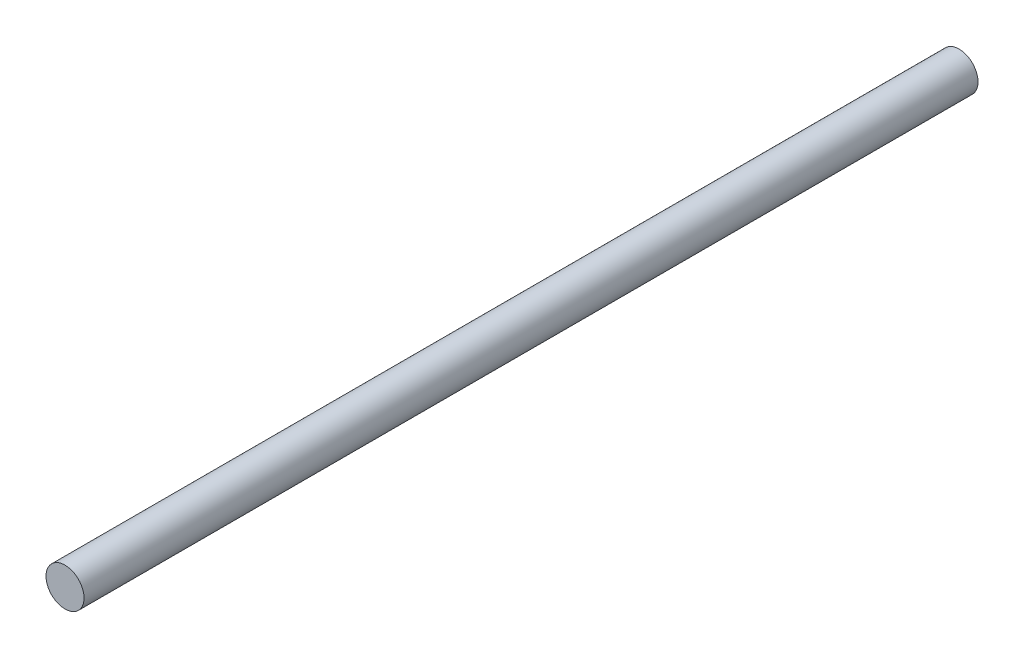
ISO-10303-21;
HEADER;
FILE_DESCRIPTION(('STEP AP214'),'2;1');
FILE_NAME('part.step','',(''),(''),'','','');
FILE_SCHEMA(('AUTOMOTIVE_DESIGN { 1 0 10303 214 1 1 1 1 }'));
ENDSEC;
DATA;
#1=APPLICATION_CONTEXT('core data for automotive mechanical design processes');
#2=APPLICATION_PROTOCOL_DEFINITION('international standard','automotive_design',2000,#1);
#3=PRODUCT_CONTEXT('',#1,'mechanical');
#4=PRODUCT('Part','Part','',(#3));
#5=PRODUCT_RELATED_PRODUCT_CATEGORY('part','',(#4));
#6=PRODUCT_DEFINITION_FORMATION('','',#4);
#7=PRODUCT_DEFINITION_CONTEXT('part definition',#1,'design');
#8=PRODUCT_DEFINITION('design','',#6,#7);
#9=PRODUCT_DEFINITION_SHAPE('','',#8);
#10=(LENGTH_UNIT() NAMED_UNIT(*) SI_UNIT(.MILLI.,.METRE.));
#11=(NAMED_UNIT(*) PLANE_ANGLE_UNIT() SI_UNIT($,.RADIAN.));
#12=(NAMED_UNIT(*) SI_UNIT($,.STERADIAN.) SOLID_ANGLE_UNIT());
#13=UNCERTAINTY_MEASURE_WITH_UNIT(LENGTH_MEASURE(1.E-05),#10,'distance_accuracy_value','');
#14=(GEOMETRIC_REPRESENTATION_CONTEXT(3) GLOBAL_UNCERTAINTY_ASSIGNED_CONTEXT((#13)) GLOBAL_UNIT_ASSIGNED_CONTEXT((#10,
#11,#12)) REPRESENTATION_CONTEXT('',''));
#15=CARTESIAN_POINT('',(0.,0.,0.));
#16=DIRECTION('',(0.,0.,1.));
#17=DIRECTION('',(1.,0.,0.));
#18=AXIS2_PLACEMENT_3D('',#15,#16,#17);
#19=CARTESIAN_POINT('',(0.,0.,117.5));
#20=DIRECTION('',(0.,0.,-1.));
#21=DIRECTION('',(-1.,0.,0.));
#22=AXIS2_PLACEMENT_3D('',#19,#20,#21);
#23=CYLINDRICAL_SURFACE('',#22,2.5);
#24=CARTESIAN_POINT('',(0.,0.,117.5));
#25=DIRECTION('',(0.,0.,1.));
#26=DIRECTION('',(1.,0.,0.));
#27=AXIS2_PLACEMENT_3D('',#24,#25,#26);
#28=CIRCLE('',#27,2.5);
#29=CARTESIAN_POINT('',(-2.5,0.,117.5));
#30=VERTEX_POINT('',#29);
#31=EDGE_CURVE('E10',#30,#30,#28,.T.);
#32=CARTESIAN_POINT('',(0.,0.,0.));
#33=DIRECTION('',(0.,0.,1.));
#34=DIRECTION('',(1.,0.,0.));
#35=AXIS2_PLACEMENT_3D('',#32,#33,#34);
#36=CIRCLE('',#35,2.5);
#37=CARTESIAN_POINT('',(-2.5,0.,0.));
#38=VERTEX_POINT('',#37);
#39=EDGE_CURVE('E42',#38,#38,#36,.T.);
#40=CARTESIAN_POINT('',(-2.5,0.,117.5));
#41=CARTESIAN_POINT('',(-2.5,0.,116.276041666667));
#42=CARTESIAN_POINT('',(-2.5,0.,115.052083333333));
#43=CARTESIAN_POINT('',(-2.5,0.,112.604166666667));
#44=CARTESIAN_POINT('',(-2.5,0.,111.380208333333));
#45=CARTESIAN_POINT('',(-2.5,0.,108.932291666667));
#46=CARTESIAN_POINT('',(-2.5,0.,107.708333333333));
#47=CARTESIAN_POINT('',(-2.5,0.,105.260416666667));
#48=CARTESIAN_POINT('',(-2.5,0.,104.036458333333));
#49=CARTESIAN_POINT('',(-2.5,0.,101.588541666667));
#50=CARTESIAN_POINT('',(-2.5,0.,100.364583333333));
#51=CARTESIAN_POINT('',(-2.5,0.,97.9166666666667));
#52=CARTESIAN_POINT('',(-2.5,0.,96.6927083333333));
#53=CARTESIAN_POINT('',(-2.5,0.,94.2447916666667));
#54=CARTESIAN_POINT('',(-2.5,0.,93.0208333333333));
#55=CARTESIAN_POINT('',(-2.5,0.,90.5729166666667));
#56=CARTESIAN_POINT('',(-2.5,0.,89.3489583333333));
#57=CARTESIAN_POINT('',(-2.5,0.,86.9010416666667));
#58=CARTESIAN_POINT('',(-2.5,0.,85.6770833333333));
#59=CARTESIAN_POINT('',(-2.5,0.,83.2291666666667));
#60=CARTESIAN_POINT('',(-2.5,0.,82.0052083333333));
#61=CARTESIAN_POINT('',(-2.5,0.,79.5572916666667));
#62=CARTESIAN_POINT('',(-2.5,0.,78.3333333333333));
#63=CARTESIAN_POINT('',(-2.5,0.,75.8854166666667));
#64=CARTESIAN_POINT('',(-2.5,0.,74.6614583333333));
#65=CARTESIAN_POINT('',(-2.5,0.,72.2135416666667));
#66=CARTESIAN_POINT('',(-2.5,0.,70.9895833333333));
#67=CARTESIAN_POINT('',(-2.5,0.,68.5416666666667));
#68=CARTESIAN_POINT('',(-2.5,0.,67.3177083333333));
#69=CARTESIAN_POINT('',(-2.5,0.,64.8697916666667));
#70=CARTESIAN_POINT('',(-2.5,0.,63.6458333333333));
#71=CARTESIAN_POINT('',(-2.5,0.,61.1979166666667));
#72=CARTESIAN_POINT('',(-2.5,0.,59.9739583333333));
#73=CARTESIAN_POINT('',(-2.5,0.,57.5260416666667));
#74=CARTESIAN_POINT('',(-2.5,0.,56.3020833333333));
#75=CARTESIAN_POINT('',(-2.5,0.,53.8541666666667));
#76=CARTESIAN_POINT('',(-2.5,0.,52.6302083333333));
#77=CARTESIAN_POINT('',(-2.5,0.,50.1822916666667));
#78=CARTESIAN_POINT('',(-2.5,0.,48.9583333333333));
#79=CARTESIAN_POINT('',(-2.5,0.,46.5104166666667));
#80=CARTESIAN_POINT('',(-2.5,0.,45.2864583333333));
#81=CARTESIAN_POINT('',(-2.5,0.,42.8385416666667));
#82=CARTESIAN_POINT('',(-2.5,0.,41.6145833333333));
#83=CARTESIAN_POINT('',(-2.5,0.,39.1666666666667));
#84=CARTESIAN_POINT('',(-2.5,0.,37.9427083333333));
#85=CARTESIAN_POINT('',(-2.5,0.,35.4947916666667));
#86=CARTESIAN_POINT('',(-2.5,0.,34.2708333333333));
#87=CARTESIAN_POINT('',(-2.5,0.,31.8229166666667));
#88=CARTESIAN_POINT('',(-2.5,0.,30.5989583333333));
#89=CARTESIAN_POINT('',(-2.5,0.,28.1510416666667));
#90=CARTESIAN_POINT('',(-2.5,0.,26.9270833333333));
#91=CARTESIAN_POINT('',(-2.5,0.,24.4791666666667));
#92=CARTESIAN_POINT('',(-2.5,0.,23.2552083333333));
#93=CARTESIAN_POINT('',(-2.5,0.,20.8072916666667));
#94=CARTESIAN_POINT('',(-2.5,0.,19.5833333333333));
#95=CARTESIAN_POINT('',(-2.5,0.,17.1354166666667));
#96=CARTESIAN_POINT('',(-2.5,0.,15.9114583333333));
#97=CARTESIAN_POINT('',(-2.5,0.,13.4635416666667));
#98=CARTESIAN_POINT('',(-2.5,0.,12.2395833333333));
#99=CARTESIAN_POINT('',(-2.5,0.,9.79166666666665));
#100=CARTESIAN_POINT('',(-2.5,0.,8.56770833333332));
#101=CARTESIAN_POINT('',(-2.5,0.,6.11979166666665));
#102=CARTESIAN_POINT('',(-2.5,0.,4.89583333333332));
#103=CARTESIAN_POINT('',(-2.5,0.,2.44791666666666));
#104=CARTESIAN_POINT('',(-2.5,0.,1.22395833333332));
#105=CARTESIAN_POINT('',(-2.5,0.,0.));
#106=B_SPLINE_CURVE_WITH_KNOTS('',3,(#40,#41,#42,#43,#44,#45,#46,#47,#48,#49,#50,#51,#52,#53,
#54,#55,#56,#57,#58,#59,#60,#61,#62,#63,#64,#65,#66,#67,#68,#69,#70,#71,#72,#73,#74,#75,#76,#77,
#78,#79,#80,#81,#82,#83,#84,#85,#86,#87,#88,#89,#90,#91,#92,#93,#94,#95,#96,#97,#98,#99,#100,
#101,#102,#103,#104,#105),.UNSPECIFIED.,.F.,.F.,(4,2,2,2,2,2,2,2,2,2,2,2,2,2,2,2,2,2,2,2,2,2,2,
2,2,2,2,2,2,2,2,2,4),(0.,3.67187499999999,7.34375,11.015625,14.6875,18.359375,22.03125,
25.703125,29.375,33.046875,36.71875,40.390625,44.0625,47.734375,51.40625,55.078125,58.75,
62.421875,66.09375,69.765625,73.4375,77.109375,80.78125,84.453125,88.125,91.796875,95.46875,
99.140625,102.8125,106.484375,110.15625,113.828125,117.5),.UNSPECIFIED.);
#107=EDGE_CURVE('BSEAM39',#30,#38,#106,.T.);
#108=ORIENTED_EDGE('',*,*,#31,.F.);
#109=ORIENTED_EDGE('',*,*,#39,.T.);
#110=ORIENTED_EDGE('',*,*,#107,.T.);
#111=ORIENTED_EDGE('',*,*,#107,.F.);
#112=EDGE_LOOP('',(#108,#110,#109,#111));
#113=FACE_BOUND('',#112,.T.);
#114=ADVANCED_FACE('F39',(#113),#23,.T.);
#115=CARTESIAN_POINT('',(0.,0.,117.5));
#116=DIRECTION('',(0.,0.,1.));
#117=DIRECTION('',(1.,0.,0.));
#118=AXIS2_PLACEMENT_3D('',#115,#116,#117);
#119=PLANE('',#118);
#120=ORIENTED_EDGE('',*,*,#31,.T.);
#121=EDGE_LOOP('',(#120));
#122=FACE_BOUND('',#121,.T.);
#123=ADVANCED_FACE('F54',(#122),#119,.T.);
#124=CARTESIAN_POINT('',(0.,0.,0.));
#125=DIRECTION('',(0.,0.,1.));
#126=DIRECTION('',(1.,0.,0.));
#127=AXIS2_PLACEMENT_3D('',#124,#125,#126);
#128=PLANE('',#127);
#129=ORIENTED_EDGE('',*,*,#39,.F.);
#130=EDGE_LOOP('',(#129));
#131=FACE_BOUND('',#130,.T.);
#132=ADVANCED_FACE('F52',(#131),#128,.F.);
#133=CLOSED_SHELL('',(#114,#123,#132));
#134=MANIFOLD_SOLID_BREP('B2',#133);
#135=ADVANCED_BREP_SHAPE_REPRESENTATION('',(#18,#134),#14);
#136=SHAPE_DEFINITION_REPRESENTATION(#9,#135);
ENDSEC;
END-ISO-10303-21;
